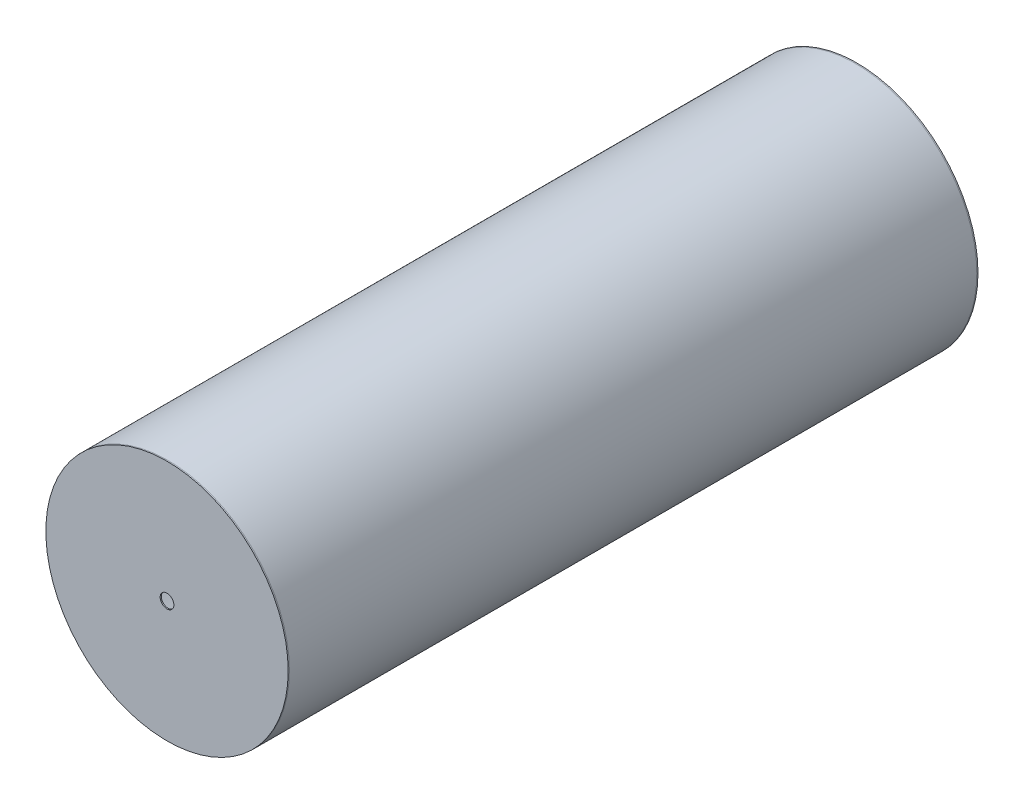
ISO-10303-21;
HEADER;
FILE_DESCRIPTION(('STEP AP214'),'2;1');
FILE_NAME('part.step','',(''),(''),'','','');
FILE_SCHEMA(('AUTOMOTIVE_DESIGN { 1 0 10303 214 1 1 1 1 }'));
ENDSEC;
DATA;
#1=APPLICATION_CONTEXT('core data for automotive mechanical design processes');
#2=APPLICATION_PROTOCOL_DEFINITION('international standard','automotive_design',2000,#1);
#3=PRODUCT_CONTEXT('',#1,'mechanical');
#4=PRODUCT('Part','Part','',(#3));
#5=PRODUCT_RELATED_PRODUCT_CATEGORY('part','',(#4));
#6=PRODUCT_DEFINITION_FORMATION('','',#4);
#7=PRODUCT_DEFINITION_CONTEXT('part definition',#1,'design');
#8=PRODUCT_DEFINITION('design','',#6,#7);
#9=PRODUCT_DEFINITION_SHAPE('','',#8);
#10=(LENGTH_UNIT() NAMED_UNIT(*) SI_UNIT(.MILLI.,.METRE.));
#11=(NAMED_UNIT(*) PLANE_ANGLE_UNIT() SI_UNIT($,.RADIAN.));
#12=(NAMED_UNIT(*) SI_UNIT($,.STERADIAN.) SOLID_ANGLE_UNIT());
#13=UNCERTAINTY_MEASURE_WITH_UNIT(LENGTH_MEASURE(1.E-05),#10,'distance_accuracy_value','');
#14=(GEOMETRIC_REPRESENTATION_CONTEXT(3) GLOBAL_UNCERTAINTY_ASSIGNED_CONTEXT((#13)) GLOBAL_UNIT_ASSIGNED_CONTEXT((#10,
#11,#12)) REPRESENTATION_CONTEXT('',''));
#15=CARTESIAN_POINT('',(0.,0.,0.));
#16=DIRECTION('',(0.,0.,1.));
#17=DIRECTION('',(1.,0.,0.));
#18=AXIS2_PLACEMENT_3D('',#15,#16,#17);
#19=CARTESIAN_POINT('',(0.,0.,1149.92));
#20=DIRECTION('',(0.,0.,-1.));
#21=DIRECTION('',(-1.,0.,0.));
#22=AXIS2_PLACEMENT_3D('',#19,#20,#21);
#23=CYLINDRICAL_SURFACE('',#22,202.);
#24=CARTESIAN_POINT('',(0.,0.,1149.92));
#25=DIRECTION('',(0.,0.,1.));
#26=DIRECTION('',(1.,0.,0.));
#27=AXIS2_PLACEMENT_3D('',#24,#25,#26);
#28=CIRCLE('',#27,202.);
#29=CARTESIAN_POINT('',(202.,0.,1149.92));
#30=VERTEX_POINT('',#29);
#31=EDGE_CURVE('E11',#30,#30,#28,.T.);
#32=ORIENTED_EDGE('',*,*,#31,.F.);
#33=EDGE_LOOP('',(#32));
#34=FACE_BOUND('',#33,.T.);
#35=CARTESIAN_POINT('',(0.,0.,1147.92));
#36=DIRECTION('',(0.,0.,1.));
#37=DIRECTION('',(1.,0.,0.));
#38=AXIS2_PLACEMENT_3D('',#35,#36,#37);
#39=CIRCLE('',#38,202.);
#40=CARTESIAN_POINT('',(202.,0.,1147.92));
#41=VERTEX_POINT('',#40);
#42=EDGE_CURVE('E55',#41,#41,#39,.T.);
#43=ORIENTED_EDGE('',*,*,#42,.T.);
#44=EDGE_LOOP('',(#43));
#45=FACE_BOUND('',#44,.T.);
#46=ADVANCED_FACE('F48',(#34,#45),#23,.T.);
#47=CARTESIAN_POINT('',(0.,0.,1149.92));
#48=DIRECTION('',(0.,0.,1.));
#49=DIRECTION('',(1.,0.,0.));
#50=AXIS2_PLACEMENT_3D('',#47,#48,#49);
#51=PLANE('',#50);
#52=CARTESIAN_POINT('',(0.,0.,1149.92));
#53=DIRECTION('',(0.,0.,1.));
#54=DIRECTION('',(1.,0.,0.));
#55=AXIS2_PLACEMENT_3D('',#52,#53,#54);
#56=CIRCLE('',#55,11.45);
#57=CARTESIAN_POINT('',(11.45,0.,1149.92));
#58=VERTEX_POINT('',#57);
#59=EDGE_CURVE('E61',#58,#58,#56,.T.);
#60=ORIENTED_EDGE('',*,*,#59,.F.);
#61=EDGE_LOOP('',(#60));
#62=FACE_BOUND('',#61,.T.);
#63=ORIENTED_EDGE('',*,*,#31,.T.);
#64=EDGE_LOOP('',(#63));
#65=FACE_BOUND('',#64,.T.);
#66=ADVANCED_FACE('F77',(#62,#65),#51,.T.);
#67=CARTESIAN_POINT('',(0.,0.,1147.92));
#68=DIRECTION('',(0.,0.,1.));
#69=DIRECTION('',(1.,0.,0.));
#70=AXIS2_PLACEMENT_3D('',#67,#68,#69);
#71=PLANE('',#70);
#72=CARTESIAN_POINT('',(0.,0.,1147.92));
#73=DIRECTION('',(0.,0.,1.));
#74=DIRECTION('',(1.,0.,0.));
#75=AXIS2_PLACEMENT_3D('',#72,#73,#74);
#76=CIRCLE('',#75,11.45);
#77=CARTESIAN_POINT('',(11.45,0.,1147.92));
#78=VERTEX_POINT('',#77);
#79=EDGE_CURVE('E51',#78,#78,#76,.T.);
#80=ORIENTED_EDGE('',*,*,#79,.T.);
#81=EDGE_LOOP('',(#80));
#82=FACE_BOUND('',#81,.T.);
#83=ORIENTED_EDGE('',*,*,#42,.F.);
#84=EDGE_LOOP('',(#83));
#85=FACE_BOUND('',#84,.T.);
#86=ADVANCED_FACE('F68',(#82,#85),#71,.F.);
#87=CARTESIAN_POINT('',(0.,0.,0.));
#88=DIRECTION('',(0.,0.,1.));
#89=DIRECTION('',(1.,0.,0.));
#90=AXIS2_PLACEMENT_3D('',#87,#88,#89);
#91=CYLINDRICAL_SURFACE('',#90,11.45);
#92=ORIENTED_EDGE('',*,*,#59,.T.);
#93=EDGE_LOOP('',(#92));
#94=FACE_BOUND('',#93,.T.);
#95=ORIENTED_EDGE('',*,*,#79,.F.);
#96=EDGE_LOOP('',(#95));
#97=FACE_BOUND('',#96,.T.);
#98=ADVANCED_FACE('F71',(#94,#97),#91,.F.);
#99=CLOSED_SHELL('',(#46,#66,#86,#98));
#100=MANIFOLD_SOLID_BREP('B2',#99);
#101=CARTESIAN_POINT('',(0.,0.,1147.92));
#102=DIRECTION('',(0.,0.,1.));
#103=DIRECTION('',(1.,0.,0.));
#104=AXIS2_PLACEMENT_3D('',#101,#102,#103);
#105=PLANE('',#104);
#106=CARTESIAN_POINT('',(0.,0.,1147.92));
#107=DIRECTION('',(0.,0.,1.));
#108=DIRECTION('',(1.,0.,0.));
#109=AXIS2_PLACEMENT_3D('',#106,#107,#108);
#110=CIRCLE('',#109,202.);
#111=CARTESIAN_POINT('',(202.,0.,1147.92));
#112=VERTEX_POINT('',#111);
#113=EDGE_CURVE('E47',#112,#112,#110,.T.);
#114=ORIENTED_EDGE('',*,*,#113,.T.);
#115=EDGE_LOOP('',(#114));
#116=FACE_BOUND('',#115,.T.);
#117=CARTESIAN_POINT('',(0.,0.,1147.92));
#118=DIRECTION('',(0.,0.,1.));
#119=DIRECTION('',(1.,0.,0.));
#120=AXIS2_PLACEMENT_3D('',#117,#118,#119);
#121=CIRCLE('',#120,200.);
#122=CARTESIAN_POINT('',(200.,0.,1147.92));
#123=VERTEX_POINT('',#122);
#124=EDGE_CURVE('E136',#123,#123,#121,.T.);
#125=ORIENTED_EDGE('',*,*,#124,.F.);
#126=EDGE_LOOP('',(#125));
#127=FACE_BOUND('',#126,.T.);
#128=ADVANCED_FACE('F125',(#116,#127),#105,.T.);
#129=CARTESIAN_POINT('',(0.,0.,2.));
#130=DIRECTION('',(0.,0.,1.));
#131=DIRECTION('',(1.,0.,0.));
#132=AXIS2_PLACEMENT_3D('',#129,#130,#131);
#133=PLANE('',#132);
#134=CARTESIAN_POINT('',(0.,0.,2.));
#135=DIRECTION('',(0.,0.,1.));
#136=DIRECTION('',(1.,0.,0.));
#137=AXIS2_PLACEMENT_3D('',#134,#135,#136);
#138=CIRCLE('',#137,202.);
#139=CARTESIAN_POINT('',(202.,0.,2.));
#140=VERTEX_POINT('',#139);
#141=EDGE_CURVE('E129',#140,#140,#138,.T.);
#142=ORIENTED_EDGE('',*,*,#141,.F.);
#143=EDGE_LOOP('',(#142));
#144=FACE_BOUND('',#143,.T.);
#145=CARTESIAN_POINT('',(0.,0.,2.));
#146=DIRECTION('',(0.,0.,1.));
#147=DIRECTION('',(1.,0.,0.));
#148=AXIS2_PLACEMENT_3D('',#145,#146,#147);
#149=CIRCLE('',#148,200.);
#150=CARTESIAN_POINT('',(200.,0.,2.));
#151=VERTEX_POINT('',#150);
#152=EDGE_CURVE('E138',#151,#151,#149,.T.);
#153=ORIENTED_EDGE('',*,*,#152,.T.);
#154=EDGE_LOOP('',(#153));
#155=FACE_BOUND('',#154,.T.);
#156=ADVANCED_FACE('F148',(#144,#155),#133,.F.);
#157=CARTESIAN_POINT('',(0.,0.,1147.92));
#158=DIRECTION('',(0.,0.,-1.));
#159=DIRECTION('',(-1.,0.,0.));
#160=AXIS2_PLACEMENT_3D('',#157,#158,#159);
#161=CYLINDRICAL_SURFACE('',#160,202.);
#162=ORIENTED_EDGE('',*,*,#113,.F.);
#163=EDGE_LOOP('',(#162));
#164=FACE_BOUND('',#163,.T.);
#165=ORIENTED_EDGE('',*,*,#141,.T.);
#166=EDGE_LOOP('',(#165));
#167=FACE_BOUND('',#166,.T.);
#168=ADVANCED_FACE('F127',(#164,#167),#161,.T.);
#169=CARTESIAN_POINT('',(0.,0.,1147.92));
#170=DIRECTION('',(0.,0.,-1.));
#171=DIRECTION('',(-1.,0.,0.));
#172=AXIS2_PLACEMENT_3D('',#169,#170,#171);
#173=CYLINDRICAL_SURFACE('',#172,200.);
#174=ORIENTED_EDGE('',*,*,#124,.T.);
#175=EDGE_LOOP('',(#174));
#176=FACE_BOUND('',#175,.T.);
#177=ORIENTED_EDGE('',*,*,#152,.F.);
#178=EDGE_LOOP('',(#177));
#179=FACE_BOUND('',#178,.T.);
#180=ADVANCED_FACE('F144',(#176,#179),#173,.F.);
#181=CLOSED_SHELL('',(#128,#156,#168,#180));
#182=MANIFOLD_SOLID_BREP('B6',#181);
#183=CARTESIAN_POINT('',(0.,0.,2.));
#184=DIRECTION('',(0.,0.,-1.));
#185=DIRECTION('',(-1.,0.,0.));
#186=AXIS2_PLACEMENT_3D('',#183,#184,#185);
#187=CYLINDRICAL_SURFACE('',#186,202.);
#188=CARTESIAN_POINT('',(0.,0.,2.));
#189=DIRECTION('',(0.,0.,1.));
#190=DIRECTION('',(1.,0.,0.));
#191=AXIS2_PLACEMENT_3D('',#188,#189,#190);
#192=CIRCLE('',#191,202.);
#193=CARTESIAN_POINT('',(202.,0.,2.));
#194=VERTEX_POINT('',#193);
#195=EDGE_CURVE('E124',#194,#194,#192,.T.);
#196=ORIENTED_EDGE('',*,*,#195,.F.);
#197=EDGE_LOOP('',(#196));
#198=FACE_BOUND('',#197,.T.);
#199=CARTESIAN_POINT('',(0.,0.,0.));
#200=DIRECTION('',(0.,0.,1.));
#201=DIRECTION('',(1.,0.,0.));
#202=AXIS2_PLACEMENT_3D('',#199,#200,#201);
#203=CIRCLE('',#202,202.);
#204=CARTESIAN_POINT('',(202.,0.,0.));
#205=VERTEX_POINT('',#204);
#206=EDGE_CURVE('E198',#205,#205,#203,.T.);
#207=ORIENTED_EDGE('',*,*,#206,.T.);
#208=EDGE_LOOP('',(#207));
#209=FACE_BOUND('',#208,.T.);
#210=ADVANCED_FACE('F195',(#198,#209),#187,.T.);
#211=CARTESIAN_POINT('',(0.,0.,2.));
#212=DIRECTION('',(0.,0.,1.));
#213=DIRECTION('',(1.,0.,0.));
#214=AXIS2_PLACEMENT_3D('',#211,#212,#213);
#215=PLANE('',#214);
#216=CARTESIAN_POINT('',(0.,0.,2.));
#217=DIRECTION('',(0.,0.,1.));
#218=DIRECTION('',(1.,0.,0.));
#219=AXIS2_PLACEMENT_3D('',#216,#217,#218);
#220=CIRCLE('',#219,11.45);
#221=CARTESIAN_POINT('',(11.45,0.,2.));
#222=VERTEX_POINT('',#221);
#223=EDGE_CURVE('E205',#222,#222,#220,.T.);
#224=ORIENTED_EDGE('',*,*,#223,.F.);
#225=EDGE_LOOP('',(#224));
#226=FACE_BOUND('',#225,.T.);
#227=ORIENTED_EDGE('',*,*,#195,.T.);
#228=EDGE_LOOP('',(#227));
#229=FACE_BOUND('',#228,.T.);
#230=ADVANCED_FACE('F223',(#226,#229),#215,.T.);
#231=CARTESIAN_POINT('',(0.,0.,0.));
#232=DIRECTION('',(0.,0.,1.));
#233=DIRECTION('',(1.,0.,0.));
#234=AXIS2_PLACEMENT_3D('',#231,#232,#233);
#235=PLANE('',#234);
#236=CARTESIAN_POINT('',(0.,0.,0.));
#237=DIRECTION('',(0.,0.,1.));
#238=DIRECTION('',(1.,0.,0.));
#239=AXIS2_PLACEMENT_3D('',#236,#237,#238);
#240=CIRCLE('',#239,11.45);
#241=CARTESIAN_POINT('',(11.45,0.,0.));
#242=VERTEX_POINT('',#241);
#243=EDGE_CURVE('E209',#242,#242,#240,.T.);
#244=ORIENTED_EDGE('',*,*,#243,.T.);
#245=EDGE_LOOP('',(#244));
#246=FACE_BOUND('',#245,.T.);
#247=ORIENTED_EDGE('',*,*,#206,.F.);
#248=EDGE_LOOP('',(#247));
#249=FACE_BOUND('',#248,.T.);
#250=ADVANCED_FACE('F213',(#246,#249),#235,.F.);
#251=CARTESIAN_POINT('',(0.,0.,0.));
#252=DIRECTION('',(0.,0.,1.));
#253=DIRECTION('',(1.,0.,0.));
#254=AXIS2_PLACEMENT_3D('',#251,#252,#253);
#255=CYLINDRICAL_SURFACE('',#254,11.45);
#256=ORIENTED_EDGE('',*,*,#223,.T.);
#257=EDGE_LOOP('',(#256));
#258=FACE_BOUND('',#257,.T.);
#259=ORIENTED_EDGE('',*,*,#243,.F.);
#260=EDGE_LOOP('',(#259));
#261=FACE_BOUND('',#260,.T.);
#262=ADVANCED_FACE('F216',(#258,#261),#255,.F.);
#263=CLOSED_SHELL('',(#210,#230,#250,#262));
#264=MANIFOLD_SOLID_BREP('B42',#263);
#265=ADVANCED_BREP_SHAPE_REPRESENTATION('',(#18,#100,#182,#264),#14);
#266=SHAPE_DEFINITION_REPRESENTATION(#9,#265);
ENDSEC;
END-ISO-10303-21;
